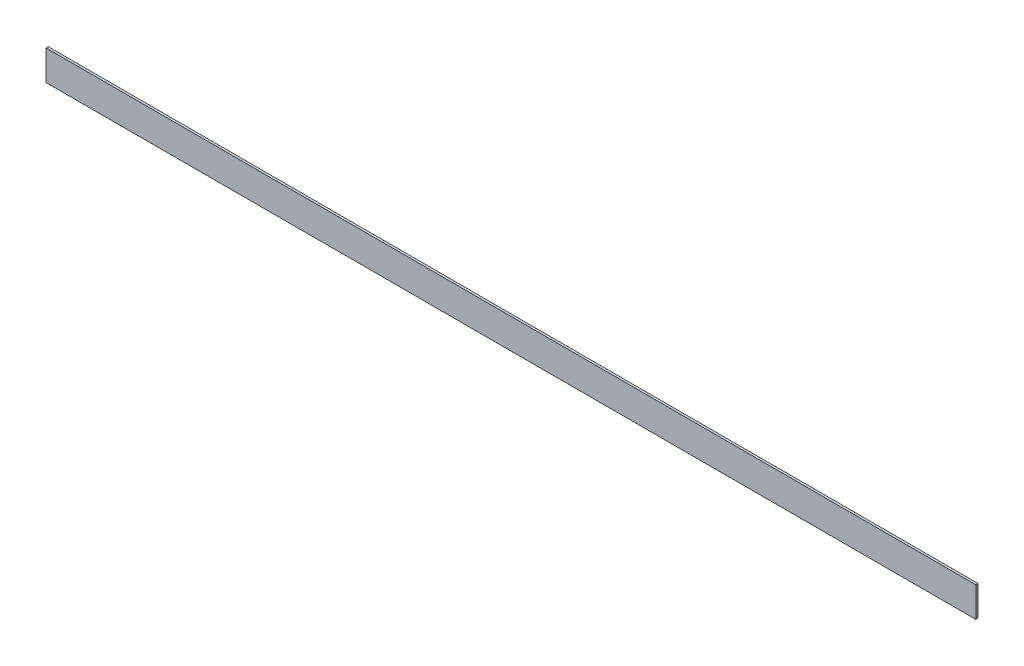
ISO-10303-21;
HEADER;
FILE_DESCRIPTION(('STEP AP214'),'2;1');
FILE_NAME('part.step','',(''),(''),'','','');
FILE_SCHEMA(('AUTOMOTIVE_DESIGN { 1 0 10303 214 1 1 1 1 }'));
ENDSEC;
DATA;
#1=APPLICATION_CONTEXT('core data for automotive mechanical design processes');
#2=APPLICATION_PROTOCOL_DEFINITION('international standard','automotive_design',2000,#1);
#3=PRODUCT_CONTEXT('',#1,'mechanical');
#4=PRODUCT('Part','Part','',(#3));
#5=PRODUCT_RELATED_PRODUCT_CATEGORY('part','',(#4));
#6=PRODUCT_DEFINITION_FORMATION('','',#4);
#7=PRODUCT_DEFINITION_CONTEXT('part definition',#1,'design');
#8=PRODUCT_DEFINITION('design','',#6,#7);
#9=PRODUCT_DEFINITION_SHAPE('','',#8);
#10=(LENGTH_UNIT() NAMED_UNIT(*) SI_UNIT(.MILLI.,.METRE.));
#11=(NAMED_UNIT(*) PLANE_ANGLE_UNIT() SI_UNIT($,.RADIAN.));
#12=(NAMED_UNIT(*) SI_UNIT($,.STERADIAN.) SOLID_ANGLE_UNIT());
#13=UNCERTAINTY_MEASURE_WITH_UNIT(LENGTH_MEASURE(1.E-05),#10,'distance_accuracy_value','');
#14=(GEOMETRIC_REPRESENTATION_CONTEXT(3) GLOBAL_UNCERTAINTY_ASSIGNED_CONTEXT((#13)) GLOBAL_UNIT_ASSIGNED_CONTEXT((#10,
#11,#12)) REPRESENTATION_CONTEXT('',''));
#15=CARTESIAN_POINT('',(0.,0.,0.));
#16=DIRECTION('',(0.,0.,1.));
#17=DIRECTION('',(1.,0.,0.));
#18=AXIS2_PLACEMENT_3D('',#15,#16,#17);
#19=CARTESIAN_POINT('',(40.,1132.,-800.));
#20=DIRECTION('',(-1.,0.,0.));
#21=DIRECTION('',(0.,0.,1.));
#22=AXIS2_PLACEMENT_3D('',#19,#20,#21);
#23=PLANE('',#22);
#24=DIRECTION('',(0.,-1.,0.));
#25=VECTOR('',#24,1.);
#26=CARTESIAN_POINT('',(40.,1132.,-798.5));
#27=LINE('',#26,#25);
#28=CARTESIAN_POINT('',(40.,1152.,-798.5));
#29=VERTEX_POINT('',#28);
#30=CARTESIAN_POINT('',(40.,1132.,-798.5));
#31=VERTEX_POINT('',#30);
#32=EDGE_CURVE('E103',#29,#31,#27,.T.);
#33=ORIENTED_EDGE('',*,*,#32,.F.);
#34=DIRECTION('',(0.,0.,1.));
#35=VECTOR('',#34,1.);
#36=CARTESIAN_POINT('',(40.,1152.,-800.));
#37=LINE('',#36,#35);
#38=CARTESIAN_POINT('',(40.,1152.,-800.));
#39=VERTEX_POINT('',#38);
#40=EDGE_CURVE('E11',#39,#29,#37,.T.);
#41=ORIENTED_EDGE('',*,*,#40,.F.);
#42=DIRECTION('',(0.,-1.,0.));
#43=VECTOR('',#42,1.);
#44=CARTESIAN_POINT('',(40.,1132.,-800.));
#45=LINE('',#44,#43);
#46=CARTESIAN_POINT('',(40.,1132.,-800.));
#47=VERTEX_POINT('',#46);
#48=EDGE_CURVE('E97',#39,#47,#45,.T.);
#49=ORIENTED_EDGE('',*,*,#48,.T.);
#50=DIRECTION('',(0.,0.,1.));
#51=VECTOR('',#50,1.);
#52=CARTESIAN_POINT('',(40.,1132.,-800.));
#53=LINE('',#52,#51);
#54=EDGE_CURVE('E42',#47,#31,#53,.T.);
#55=ORIENTED_EDGE('',*,*,#54,.T.);
#56=EDGE_LOOP('',(#33,#41,#49,#55));
#57=FACE_BOUND('',#56,.T.);
#58=ADVANCED_FACE('F39',(#57),#23,.T.);
#59=CARTESIAN_POINT('',(40.,1152.,-800.));
#60=DIRECTION('',(0.,1.,0.));
#61=DIRECTION('',(0.,0.,1.));
#62=AXIS2_PLACEMENT_3D('',#59,#60,#61);
#63=PLANE('',#62);
#64=DIRECTION('',(-1.,0.,0.));
#65=VECTOR('',#64,1.);
#66=CARTESIAN_POINT('',(40.,1152.,-798.5));
#67=LINE('',#66,#65);
#68=CARTESIAN_POINT('',(660.,1152.,-798.5));
#69=VERTEX_POINT('',#68);
#70=EDGE_CURVE('E99',#69,#29,#67,.T.);
#71=ORIENTED_EDGE('',*,*,#70,.F.);
#72=DIRECTION('',(0.,0.,1.));
#73=VECTOR('',#72,1.);
#74=CARTESIAN_POINT('',(660.,1152.,-800.));
#75=LINE('',#74,#73);
#76=CARTESIAN_POINT('',(660.,1152.,-800.));
#77=VERTEX_POINT('',#76);
#78=EDGE_CURVE('E48',#77,#69,#75,.T.);
#79=ORIENTED_EDGE('',*,*,#78,.F.);
#80=DIRECTION('',(-1.,0.,0.));
#81=VECTOR('',#80,1.);
#82=CARTESIAN_POINT('',(40.,1152.,-800.));
#83=LINE('',#82,#81);
#84=EDGE_CURVE('E94',#77,#39,#83,.T.);
#85=ORIENTED_EDGE('',*,*,#84,.T.);
#86=ORIENTED_EDGE('',*,*,#40,.T.);
#87=EDGE_LOOP('',(#71,#79,#85,#86));
#88=FACE_BOUND('',#87,.T.);
#89=ADVANCED_FACE('F113',(#88),#63,.T.);
#90=CARTESIAN_POINT('',(660.,1132.,-800.));
#91=DIRECTION('',(1.,0.,0.));
#92=DIRECTION('',(0.,0.,-1.));
#93=AXIS2_PLACEMENT_3D('',#90,#91,#92);
#94=PLANE('',#93);
#95=DIRECTION('',(0.,1.,0.));
#96=VECTOR('',#95,1.);
#97=CARTESIAN_POINT('',(660.,1132.,-798.5));
#98=LINE('',#97,#96);
#99=CARTESIAN_POINT('',(660.,1132.,-798.5));
#100=VERTEX_POINT('',#99);
#101=EDGE_CURVE('E89',#100,#69,#98,.T.);
#102=ORIENTED_EDGE('',*,*,#101,.F.);
#103=DIRECTION('',(0.,0.,1.));
#104=VECTOR('',#103,1.);
#105=CARTESIAN_POINT('',(660.,1132.,-800.));
#106=LINE('',#105,#104);
#107=CARTESIAN_POINT('',(660.,1132.,-800.));
#108=VERTEX_POINT('',#107);
#109=EDGE_CURVE('E84',#108,#100,#106,.T.);
#110=ORIENTED_EDGE('',*,*,#109,.F.);
#111=DIRECTION('',(0.,1.,0.));
#112=VECTOR('',#111,1.);
#113=CARTESIAN_POINT('',(660.,1132.,-800.));
#114=LINE('',#113,#112);
#115=EDGE_CURVE('E87',#108,#77,#114,.T.);
#116=ORIENTED_EDGE('',*,*,#115,.T.);
#117=ORIENTED_EDGE('',*,*,#78,.T.);
#118=EDGE_LOOP('',(#102,#110,#116,#117));
#119=FACE_BOUND('',#118,.T.);
#120=ADVANCED_FACE('F86',(#119),#94,.T.);
#121=CARTESIAN_POINT('',(40.,1132.,-800.));
#122=DIRECTION('',(0.,-1.,0.));
#123=DIRECTION('',(0.,0.,-1.));
#124=AXIS2_PLACEMENT_3D('',#121,#122,#123);
#125=PLANE('',#124);
#126=DIRECTION('',(1.,0.,0.));
#127=VECTOR('',#126,1.);
#128=CARTESIAN_POINT('',(40.,1132.,-798.5));
#129=LINE('',#128,#127);
#130=EDGE_CURVE('E106',#31,#100,#129,.T.);
#131=ORIENTED_EDGE('',*,*,#130,.F.);
#132=ORIENTED_EDGE('',*,*,#54,.F.);
#133=DIRECTION('',(1.,0.,0.));
#134=VECTOR('',#133,1.);
#135=CARTESIAN_POINT('',(40.,1132.,-800.));
#136=LINE('',#135,#134);
#137=EDGE_CURVE('E93',#47,#108,#136,.T.);
#138=ORIENTED_EDGE('',*,*,#137,.T.);
#139=ORIENTED_EDGE('',*,*,#109,.T.);
#140=EDGE_LOOP('',(#131,#132,#138,#139));
#141=FACE_BOUND('',#140,.T.);
#142=ADVANCED_FACE('F96',(#141),#125,.T.);
#143=CARTESIAN_POINT('',(0.,0.,-800.));
#144=DIRECTION('',(0.,0.,-1.));
#145=DIRECTION('',(-1.,0.,0.));
#146=AXIS2_PLACEMENT_3D('',#143,#144,#145);
#147=PLANE('',#146);
#148=ORIENTED_EDGE('',*,*,#48,.F.);
#149=ORIENTED_EDGE('',*,*,#84,.F.);
#150=ORIENTED_EDGE('',*,*,#115,.F.);
#151=ORIENTED_EDGE('',*,*,#137,.F.);
#152=EDGE_LOOP('',(#148,#149,#150,#151));
#153=FACE_BOUND('',#152,.T.);
#154=ADVANCED_FACE('F92',(#153),#147,.T.);
#155=CARTESIAN_POINT('',(0.,0.,-798.5));
#156=DIRECTION('',(0.,0.,-1.));
#157=DIRECTION('',(-1.,0.,0.));
#158=AXIS2_PLACEMENT_3D('',#155,#156,#157);
#159=PLANE('',#158);
#160=ORIENTED_EDGE('',*,*,#32,.T.);
#161=ORIENTED_EDGE('',*,*,#130,.T.);
#162=ORIENTED_EDGE('',*,*,#101,.T.);
#163=ORIENTED_EDGE('',*,*,#70,.T.);
#164=EDGE_LOOP('',(#160,#161,#162,#163));
#165=FACE_BOUND('',#164,.T.);
#166=ADVANCED_FACE('F112',(#165),#159,.F.);
#167=CLOSED_SHELL('',(#58,#89,#120,#142,#154,#166));
#168=MANIFOLD_SOLID_BREP('B2',#167);
#169=ADVANCED_BREP_SHAPE_REPRESENTATION('',(#18,#168),#14);
#170=SHAPE_DEFINITION_REPRESENTATION(#9,#169);
ENDSEC;
END-ISO-10303-21;
